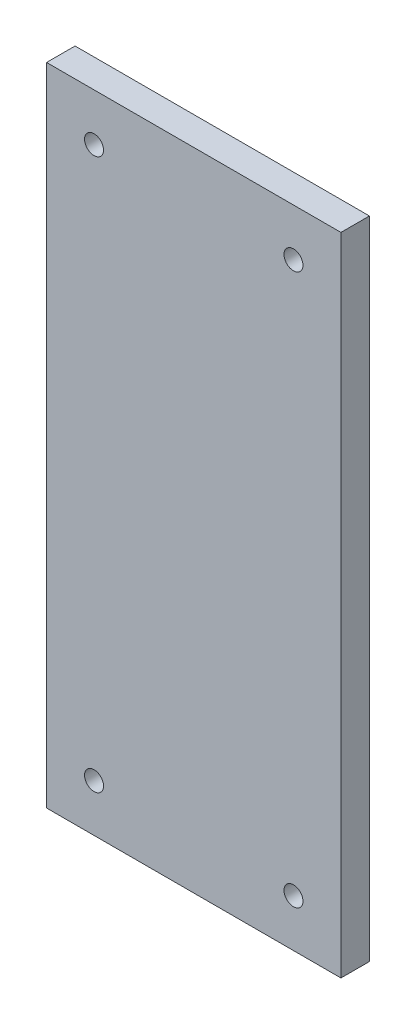
ISO-10303-21;
HEADER;
FILE_DESCRIPTION(('STEP AP214'),'2;1');
FILE_NAME('part.step','',(''),(''),'','','');
FILE_SCHEMA(('AUTOMOTIVE_DESIGN { 1 0 10303 214 1 1 1 1 }'));
ENDSEC;
DATA;
#1=APPLICATION_CONTEXT('core data for automotive mechanical design processes');
#2=APPLICATION_PROTOCOL_DEFINITION('international standard','automotive_design',2000,#1);
#3=PRODUCT_CONTEXT('',#1,'mechanical');
#4=PRODUCT('Part','Part','',(#3));
#5=PRODUCT_RELATED_PRODUCT_CATEGORY('part','',(#4));
#6=PRODUCT_DEFINITION_FORMATION('','',#4);
#7=PRODUCT_DEFINITION_CONTEXT('part definition',#1,'design');
#8=PRODUCT_DEFINITION('design','',#6,#7);
#9=PRODUCT_DEFINITION_SHAPE('','',#8);
#10=(LENGTH_UNIT() NAMED_UNIT(*) SI_UNIT(.MILLI.,.METRE.));
#11=(NAMED_UNIT(*) PLANE_ANGLE_UNIT() SI_UNIT($,.RADIAN.));
#12=(NAMED_UNIT(*) SI_UNIT($,.STERADIAN.) SOLID_ANGLE_UNIT());
#13=UNCERTAINTY_MEASURE_WITH_UNIT(LENGTH_MEASURE(1.E-05),#10,'distance_accuracy_value','');
#14=(GEOMETRIC_REPRESENTATION_CONTEXT(3) GLOBAL_UNCERTAINTY_ASSIGNED_CONTEXT((#13)) GLOBAL_UNIT_ASSIGNED_CONTEXT((#10,
#11,#12)) REPRESENTATION_CONTEXT('',''));
#15=CARTESIAN_POINT('',(0.,0.,0.));
#16=DIRECTION('',(0.,0.,1.));
#17=DIRECTION('',(1.,0.,0.));
#18=AXIS2_PLACEMENT_3D('',#15,#16,#17);
#19=CARTESIAN_POINT('',(31.,0.,3.));
#20=DIRECTION('',(0.,1.,0.));
#21=DIRECTION('',(-1.,0.,0.));
#22=AXIS2_PLACEMENT_3D('',#19,#20,#21);
#23=PLANE('',#22);
#24=DIRECTION('',(1.,0.,0.));
#25=VECTOR('',#24,1.);
#26=CARTESIAN_POINT('',(31.,0.,0.));
#27=LINE('',#26,#25);
#28=CARTESIAN_POINT('',(0.,0.,0.));
#29=VERTEX_POINT('',#28);
#30=CARTESIAN_POINT('',(31.,0.,0.));
#31=VERTEX_POINT('',#30);
#32=EDGE_CURVE('E98',#29,#31,#27,.T.);
#33=ORIENTED_EDGE('',*,*,#32,.T.);
#34=DIRECTION('',(0.,0.,-1.));
#35=VECTOR('',#34,1.);
#36=CARTESIAN_POINT('',(31.,0.,3.));
#37=LINE('',#36,#35);
#38=CARTESIAN_POINT('',(31.,0.,3.));
#39=VERTEX_POINT('',#38);
#40=EDGE_CURVE('E11',#39,#31,#37,.T.);
#41=ORIENTED_EDGE('',*,*,#40,.F.);
#42=DIRECTION('',(1.,0.,0.));
#43=VECTOR('',#42,1.);
#44=CARTESIAN_POINT('',(31.,0.,3.));
#45=LINE('',#44,#43);
#46=CARTESIAN_POINT('',(0.,0.,3.));
#47=VERTEX_POINT('',#46);
#48=EDGE_CURVE('E86',#47,#39,#45,.T.);
#49=ORIENTED_EDGE('',*,*,#48,.F.);
#50=DIRECTION('',(0.,0.,-1.));
#51=VECTOR('',#50,1.);
#52=CARTESIAN_POINT('',(0.,0.,3.));
#53=LINE('',#52,#51);
#54=EDGE_CURVE('E94',#47,#29,#53,.T.);
#55=ORIENTED_EDGE('',*,*,#54,.T.);
#56=EDGE_LOOP('',(#33,#41,#49,#55));
#57=FACE_BOUND('',#56,.T.);
#58=ADVANCED_FACE('F35',(#57),#23,.F.);
#59=CARTESIAN_POINT('',(31.,68.,3.));
#60=DIRECTION('',(-1.,0.,0.));
#61=DIRECTION('',(0.,-1.,0.));
#62=AXIS2_PLACEMENT_3D('',#59,#60,#61);
#63=PLANE('',#62);
#64=DIRECTION('',(0.,1.,0.));
#65=VECTOR('',#64,1.);
#66=CARTESIAN_POINT('',(31.,68.,0.));
#67=LINE('',#66,#65);
#68=CARTESIAN_POINT('',(31.,68.,0.));
#69=VERTEX_POINT('',#68);
#70=EDGE_CURVE('E90',#31,#69,#67,.T.);
#71=ORIENTED_EDGE('',*,*,#70,.T.);
#72=DIRECTION('',(0.,0.,-1.));
#73=VECTOR('',#72,1.);
#74=CARTESIAN_POINT('',(31.,68.,3.));
#75=LINE('',#74,#73);
#76=CARTESIAN_POINT('',(31.,68.,3.));
#77=VERTEX_POINT('',#76);
#78=EDGE_CURVE('E43',#77,#69,#75,.T.);
#79=ORIENTED_EDGE('',*,*,#78,.F.);
#80=DIRECTION('',(0.,1.,0.));
#81=VECTOR('',#80,1.);
#82=CARTESIAN_POINT('',(31.,68.,3.));
#83=LINE('',#82,#81);
#84=EDGE_CURVE('E81',#39,#77,#83,.T.);
#85=ORIENTED_EDGE('',*,*,#84,.F.);
#86=ORIENTED_EDGE('',*,*,#40,.T.);
#87=EDGE_LOOP('',(#71,#79,#85,#86));
#88=FACE_BOUND('',#87,.T.);
#89=ADVANCED_FACE('F89',(#88),#63,.F.);
#90=CARTESIAN_POINT('',(0.,68.,3.));
#91=DIRECTION('',(0.,-1.,0.));
#92=DIRECTION('',(0.,0.,-1.));
#93=AXIS2_PLACEMENT_3D('',#90,#91,#92);
#94=PLANE('',#93);
#95=DIRECTION('',(-1.,0.,0.));
#96=VECTOR('',#95,1.);
#97=CARTESIAN_POINT('',(0.,68.,0.));
#98=LINE('',#97,#96);
#99=CARTESIAN_POINT('',(0.,68.,0.));
#100=VERTEX_POINT('',#99);
#101=EDGE_CURVE('E68',#69,#100,#98,.T.);
#102=ORIENTED_EDGE('',*,*,#101,.T.);
#103=DIRECTION('',(0.,0.,-1.));
#104=VECTOR('',#103,1.);
#105=CARTESIAN_POINT('',(0.,68.,3.));
#106=LINE('',#105,#104);
#107=CARTESIAN_POINT('',(0.,68.,3.));
#108=VERTEX_POINT('',#107);
#109=EDGE_CURVE('E91',#108,#100,#106,.T.);
#110=ORIENTED_EDGE('',*,*,#109,.F.);
#111=DIRECTION('',(-1.,0.,0.));
#112=VECTOR('',#111,1.);
#113=CARTESIAN_POINT('',(0.,68.,3.));
#114=LINE('',#113,#112);
#115=EDGE_CURVE('E84',#77,#108,#114,.T.);
#116=ORIENTED_EDGE('',*,*,#115,.F.);
#117=ORIENTED_EDGE('',*,*,#78,.T.);
#118=EDGE_LOOP('',(#102,#110,#116,#117));
#119=FACE_BOUND('',#118,.T.);
#120=ADVANCED_FACE('F92',(#119),#94,.F.);
#121=CARTESIAN_POINT('',(0.,0.,3.));
#122=DIRECTION('',(1.,0.,0.));
#123=DIRECTION('',(0.,0.,-1.));
#124=AXIS2_PLACEMENT_3D('',#121,#122,#123);
#125=PLANE('',#124);
#126=DIRECTION('',(0.,-1.,0.));
#127=VECTOR('',#126,1.);
#128=CARTESIAN_POINT('',(0.,0.,0.));
#129=LINE('',#128,#127);
#130=EDGE_CURVE('E74',#100,#29,#129,.T.);
#131=ORIENTED_EDGE('',*,*,#130,.T.);
#132=ORIENTED_EDGE('',*,*,#54,.F.);
#133=DIRECTION('',(0.,-1.,0.));
#134=VECTOR('',#133,1.);
#135=CARTESIAN_POINT('',(0.,0.,3.));
#136=LINE('',#135,#134);
#137=EDGE_CURVE('E51',#108,#47,#136,.T.);
#138=ORIENTED_EDGE('',*,*,#137,.F.);
#139=ORIENTED_EDGE('',*,*,#109,.T.);
#140=EDGE_LOOP('',(#131,#132,#138,#139));
#141=FACE_BOUND('',#140,.T.);
#142=ADVANCED_FACE('F106',(#141),#125,.F.);
#143=CARTESIAN_POINT('',(0.,0.,3.));
#144=DIRECTION('',(0.,0.,-1.));
#145=DIRECTION('',(-1.,0.,0.));
#146=AXIS2_PLACEMENT_3D('',#143,#144,#145);
#147=PLANE('',#146);
#148=CARTESIAN_POINT('',(5.,63.,3.));
#149=DIRECTION('',(0.,0.,1.));
#150=DIRECTION('',(1.,0.,0.));
#151=AXIS2_PLACEMENT_3D('',#148,#149,#150);
#152=CIRCLE('',#151,1.);
#153=CARTESIAN_POINT('',(6.,63.,3.));
#154=VERTEX_POINT('',#153);
#155=EDGE_CURVE('E132',#154,#154,#152,.T.);
#156=ORIENTED_EDGE('',*,*,#155,.F.);
#157=EDGE_LOOP('',(#156));
#158=FACE_BOUND('',#157,.T.);
#159=CARTESIAN_POINT('',(26.,63.,3.));
#160=DIRECTION('',(0.,0.,1.));
#161=DIRECTION('',(1.,0.,0.));
#162=AXIS2_PLACEMENT_3D('',#159,#160,#161);
#163=CIRCLE('',#162,1.);
#164=CARTESIAN_POINT('',(27.,63.,3.));
#165=VERTEX_POINT('',#164);
#166=EDGE_CURVE('E126',#165,#165,#163,.T.);
#167=ORIENTED_EDGE('',*,*,#166,.F.);
#168=EDGE_LOOP('',(#167));
#169=FACE_BOUND('',#168,.T.);
#170=CARTESIAN_POINT('',(26.,5.,3.));
#171=DIRECTION('',(0.,0.,1.));
#172=DIRECTION('',(1.,0.,0.));
#173=AXIS2_PLACEMENT_3D('',#170,#171,#172);
#174=CIRCLE('',#173,1.);
#175=CARTESIAN_POINT('',(27.,5.,3.));
#176=VERTEX_POINT('',#175);
#177=EDGE_CURVE('E120',#176,#176,#174,.T.);
#178=ORIENTED_EDGE('',*,*,#177,.F.);
#179=EDGE_LOOP('',(#178));
#180=FACE_BOUND('',#179,.T.);
#181=CARTESIAN_POINT('',(5.,5.,3.));
#182=DIRECTION('',(0.,0.,1.));
#183=DIRECTION('',(1.,0.,0.));
#184=AXIS2_PLACEMENT_3D('',#181,#182,#183);
#185=CIRCLE('',#184,1.);
#186=CARTESIAN_POINT('',(6.,5.,3.));
#187=VERTEX_POINT('',#186);
#188=EDGE_CURVE('E114',#187,#187,#185,.T.);
#189=ORIENTED_EDGE('',*,*,#188,.F.);
#190=EDGE_LOOP('',(#189));
#191=FACE_BOUND('',#190,.T.);
#192=ORIENTED_EDGE('',*,*,#48,.T.);
#193=ORIENTED_EDGE('',*,*,#84,.T.);
#194=ORIENTED_EDGE('',*,*,#115,.T.);
#195=ORIENTED_EDGE('',*,*,#137,.T.);
#196=EDGE_LOOP('',(#192,#193,#194,#195));
#197=FACE_BOUND('',#196,.T.);
#198=ADVANCED_FACE('F82',(#158,#169,#180,#191,#197),#147,.F.);
#199=CARTESIAN_POINT('',(0.,0.,0.));
#200=DIRECTION('',(0.,0.,-1.));
#201=DIRECTION('',(-1.,0.,0.));
#202=AXIS2_PLACEMENT_3D('',#199,#200,#201);
#203=PLANE('',#202);
#204=CARTESIAN_POINT('',(5.,63.,0.));
#205=DIRECTION('',(0.,0.,1.));
#206=DIRECTION('',(1.,0.,0.));
#207=AXIS2_PLACEMENT_3D('',#204,#205,#206);
#208=CIRCLE('',#207,0.999999999999999);
#209=CARTESIAN_POINT('',(6.,63.,0.));
#210=VERTEX_POINT('',#209);
#211=EDGE_CURVE('E129',#210,#210,#208,.T.);
#212=ORIENTED_EDGE('',*,*,#211,.T.);
#213=EDGE_LOOP('',(#212));
#214=FACE_BOUND('',#213,.T.);
#215=CARTESIAN_POINT('',(26.,63.,0.));
#216=DIRECTION('',(0.,0.,1.));
#217=DIRECTION('',(1.,0.,0.));
#218=AXIS2_PLACEMENT_3D('',#215,#216,#217);
#219=CIRCLE('',#218,1.);
#220=CARTESIAN_POINT('',(27.,63.,0.));
#221=VERTEX_POINT('',#220);
#222=EDGE_CURVE('E123',#221,#221,#219,.T.);
#223=ORIENTED_EDGE('',*,*,#222,.T.);
#224=EDGE_LOOP('',(#223));
#225=FACE_BOUND('',#224,.T.);
#226=CARTESIAN_POINT('',(26.,5.,0.));
#227=DIRECTION('',(0.,0.,1.));
#228=DIRECTION('',(1.,0.,0.));
#229=AXIS2_PLACEMENT_3D('',#226,#227,#228);
#230=CIRCLE('',#229,1.);
#231=CARTESIAN_POINT('',(27.,5.,0.));
#232=VERTEX_POINT('',#231);
#233=EDGE_CURVE('E117',#232,#232,#230,.T.);
#234=ORIENTED_EDGE('',*,*,#233,.T.);
#235=EDGE_LOOP('',(#234));
#236=FACE_BOUND('',#235,.T.);
#237=CARTESIAN_POINT('',(5.,5.,0.));
#238=DIRECTION('',(0.,0.,1.));
#239=DIRECTION('',(1.,0.,0.));
#240=AXIS2_PLACEMENT_3D('',#237,#238,#239);
#241=CIRCLE('',#240,0.999999999999999);
#242=CARTESIAN_POINT('',(6.,5.,0.));
#243=VERTEX_POINT('',#242);
#244=EDGE_CURVE('E101',#243,#243,#241,.T.);
#245=ORIENTED_EDGE('',*,*,#244,.T.);
#246=EDGE_LOOP('',(#245));
#247=FACE_BOUND('',#246,.T.);
#248=ORIENTED_EDGE('',*,*,#32,.F.);
#249=ORIENTED_EDGE('',*,*,#130,.F.);
#250=ORIENTED_EDGE('',*,*,#101,.F.);
#251=ORIENTED_EDGE('',*,*,#70,.F.);
#252=EDGE_LOOP('',(#248,#249,#250,#251));
#253=FACE_BOUND('',#252,.T.);
#254=ADVANCED_FACE('F109',(#214,#225,#236,#247,#253),#203,.T.);
#255=CARTESIAN_POINT('',(5.,5.,3.));
#256=DIRECTION('',(0.,0.,1.));
#257=DIRECTION('',(1.,0.,0.));
#258=AXIS2_PLACEMENT_3D('',#255,#256,#257);
#259=CYLINDRICAL_SURFACE('',#258,1.);
#260=ORIENTED_EDGE('',*,*,#244,.F.);
#261=EDGE_LOOP('',(#260));
#262=FACE_BOUND('',#261,.T.);
#263=ORIENTED_EDGE('',*,*,#188,.T.);
#264=EDGE_LOOP('',(#263));
#265=FACE_BOUND('',#264,.T.);
#266=ADVANCED_FACE('F147',(#262,#265),#259,.F.);
#267=CARTESIAN_POINT('',(26.,5.,3.));
#268=DIRECTION('',(0.,0.,1.));
#269=DIRECTION('',(1.,0.,0.));
#270=AXIS2_PLACEMENT_3D('',#267,#268,#269);
#271=CYLINDRICAL_SURFACE('',#270,1.);
#272=ORIENTED_EDGE('',*,*,#233,.F.);
#273=EDGE_LOOP('',(#272));
#274=FACE_BOUND('',#273,.T.);
#275=ORIENTED_EDGE('',*,*,#177,.T.);
#276=EDGE_LOOP('',(#275));
#277=FACE_BOUND('',#276,.T.);
#278=ADVANCED_FACE('F149',(#274,#277),#271,.F.);
#279=CARTESIAN_POINT('',(26.,63.,3.));
#280=DIRECTION('',(0.,0.,1.));
#281=DIRECTION('',(1.,0.,0.));
#282=AXIS2_PLACEMENT_3D('',#279,#280,#281);
#283=CYLINDRICAL_SURFACE('',#282,1.);
#284=ORIENTED_EDGE('',*,*,#222,.F.);
#285=EDGE_LOOP('',(#284));
#286=FACE_BOUND('',#285,.T.);
#287=ORIENTED_EDGE('',*,*,#166,.T.);
#288=EDGE_LOOP('',(#287));
#289=FACE_BOUND('',#288,.T.);
#290=ADVANCED_FACE('F156',(#286,#289),#283,.F.);
#291=CARTESIAN_POINT('',(5.,63.,3.));
#292=DIRECTION('',(0.,0.,1.));
#293=DIRECTION('',(1.,0.,0.));
#294=AXIS2_PLACEMENT_3D('',#291,#292,#293);
#295=CYLINDRICAL_SURFACE('',#294,1.);
#296=ORIENTED_EDGE('',*,*,#211,.F.);
#297=EDGE_LOOP('',(#296));
#298=FACE_BOUND('',#297,.T.);
#299=ORIENTED_EDGE('',*,*,#155,.T.);
#300=EDGE_LOOP('',(#299));
#301=FACE_BOUND('',#300,.T.);
#302=ADVANCED_FACE('F136',(#298,#301),#295,.F.);
#303=CLOSED_SHELL('',(#58,#89,#120,#142,#198,#254,#266,#278,#290,#302));
#304=MANIFOLD_SOLID_BREP('B2',#303);
#305=ADVANCED_BREP_SHAPE_REPRESENTATION('',(#18,#304),#14);
#306=SHAPE_DEFINITION_REPRESENTATION(#9,#305);
ENDSEC;
END-ISO-10303-21;
